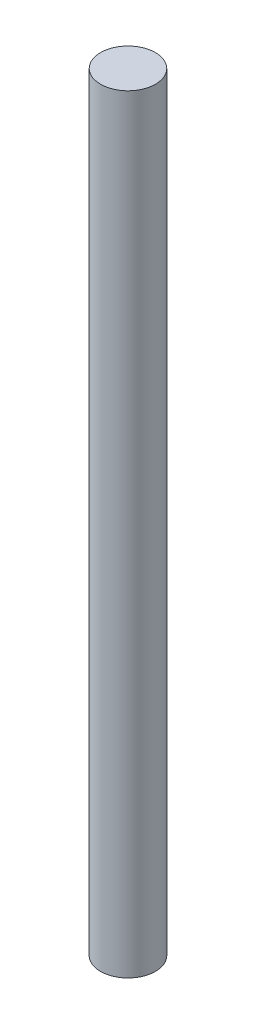
ISO-10303-21;
HEADER;
FILE_DESCRIPTION(('STEP AP214'),'2;1');
FILE_NAME('part.step','',(''),(''),'','','');
FILE_SCHEMA(('AUTOMOTIVE_DESIGN { 1 0 10303 214 1 1 1 1 }'));
ENDSEC;
DATA;
#1=APPLICATION_CONTEXT('core data for automotive mechanical design processes');
#2=APPLICATION_PROTOCOL_DEFINITION('international standard','automotive_design',2000,#1);
#3=PRODUCT_CONTEXT('',#1,'mechanical');
#4=PRODUCT('Part','Part','',(#3));
#5=PRODUCT_RELATED_PRODUCT_CATEGORY('part','',(#4));
#6=PRODUCT_DEFINITION_FORMATION('','',#4);
#7=PRODUCT_DEFINITION_CONTEXT('part definition',#1,'design');
#8=PRODUCT_DEFINITION('design','',#6,#7);
#9=PRODUCT_DEFINITION_SHAPE('','',#8);
#10=(LENGTH_UNIT() NAMED_UNIT(*) SI_UNIT(.MILLI.,.METRE.));
#11=(NAMED_UNIT(*) PLANE_ANGLE_UNIT() SI_UNIT($,.RADIAN.));
#12=(NAMED_UNIT(*) SI_UNIT($,.STERADIAN.) SOLID_ANGLE_UNIT());
#13=UNCERTAINTY_MEASURE_WITH_UNIT(LENGTH_MEASURE(1.E-05),#10,'distance_accuracy_value','');
#14=(GEOMETRIC_REPRESENTATION_CONTEXT(3) GLOBAL_UNCERTAINTY_ASSIGNED_CONTEXT((#13)) GLOBAL_UNIT_ASSIGNED_CONTEXT((#10,
#11,#12)) REPRESENTATION_CONTEXT('',''));
#15=CARTESIAN_POINT('',(0.,0.,0.));
#16=DIRECTION('',(0.,0.,1.));
#17=DIRECTION('',(1.,0.,0.));
#18=AXIS2_PLACEMENT_3D('',#15,#16,#17);
#19=CARTESIAN_POINT('',(0.,88.9,0.));
#20=DIRECTION('',(0.,-1.,0.));
#21=DIRECTION('',(0.,0.,-1.));
#22=AXIS2_PLACEMENT_3D('',#19,#20,#21);
#23=CYLINDRICAL_SURFACE('',#22,3.175);
#24=CARTESIAN_POINT('',(0.,88.9,0.));
#25=DIRECTION('',(0.,1.,0.));
#26=DIRECTION('',(0.,0.,1.));
#27=AXIS2_PLACEMENT_3D('',#24,#25,#26);
#28=CIRCLE('',#27,3.175);
#29=CARTESIAN_POINT('',(0.,88.9,3.175));
#30=VERTEX_POINT('',#29);
#31=EDGE_CURVE('E10',#30,#30,#28,.T.);
#32=ORIENTED_EDGE('',*,*,#31,.F.);
#33=EDGE_LOOP('',(#32));
#34=FACE_BOUND('',#33,.T.);
#35=CARTESIAN_POINT('',(0.,0.,0.));
#36=DIRECTION('',(0.,1.,0.));
#37=DIRECTION('',(0.,0.,1.));
#38=AXIS2_PLACEMENT_3D('',#35,#36,#37);
#39=CIRCLE('',#38,3.175);
#40=CARTESIAN_POINT('',(0.,0.,3.175));
#41=VERTEX_POINT('',#40);
#42=EDGE_CURVE('E32',#41,#41,#39,.T.);
#43=ORIENTED_EDGE('',*,*,#42,.T.);
#44=EDGE_LOOP('',(#43));
#45=FACE_BOUND('',#44,.T.);
#46=ADVANCED_FACE('F29',(#34,#45),#23,.T.);
#47=CARTESIAN_POINT('',(0.,88.9,0.));
#48=DIRECTION('',(0.,1.,0.));
#49=DIRECTION('',(0.,0.,1.));
#50=AXIS2_PLACEMENT_3D('',#47,#48,#49);
#51=PLANE('',#50);
#52=ORIENTED_EDGE('',*,*,#31,.T.);
#53=EDGE_LOOP('',(#52));
#54=FACE_BOUND('',#53,.T.);
#55=ADVANCED_FACE('F44',(#54),#51,.T.);
#56=CARTESIAN_POINT('',(0.,0.,0.));
#57=DIRECTION('',(0.,1.,0.));
#58=DIRECTION('',(0.,0.,1.));
#59=AXIS2_PLACEMENT_3D('',#56,#57,#58);
#60=PLANE('',#59);
#61=ORIENTED_EDGE('',*,*,#42,.F.);
#62=EDGE_LOOP('',(#61));
#63=FACE_BOUND('',#62,.T.);
#64=ADVANCED_FACE('F42',(#63),#60,.F.);
#65=CLOSED_SHELL('',(#46,#55,#64));
#66=MANIFOLD_SOLID_BREP('B2',#65);
#67=ADVANCED_BREP_SHAPE_REPRESENTATION('',(#18,#66),#14);
#68=SHAPE_DEFINITION_REPRESENTATION(#9,#67);
ENDSEC;
END-ISO-10303-21;
